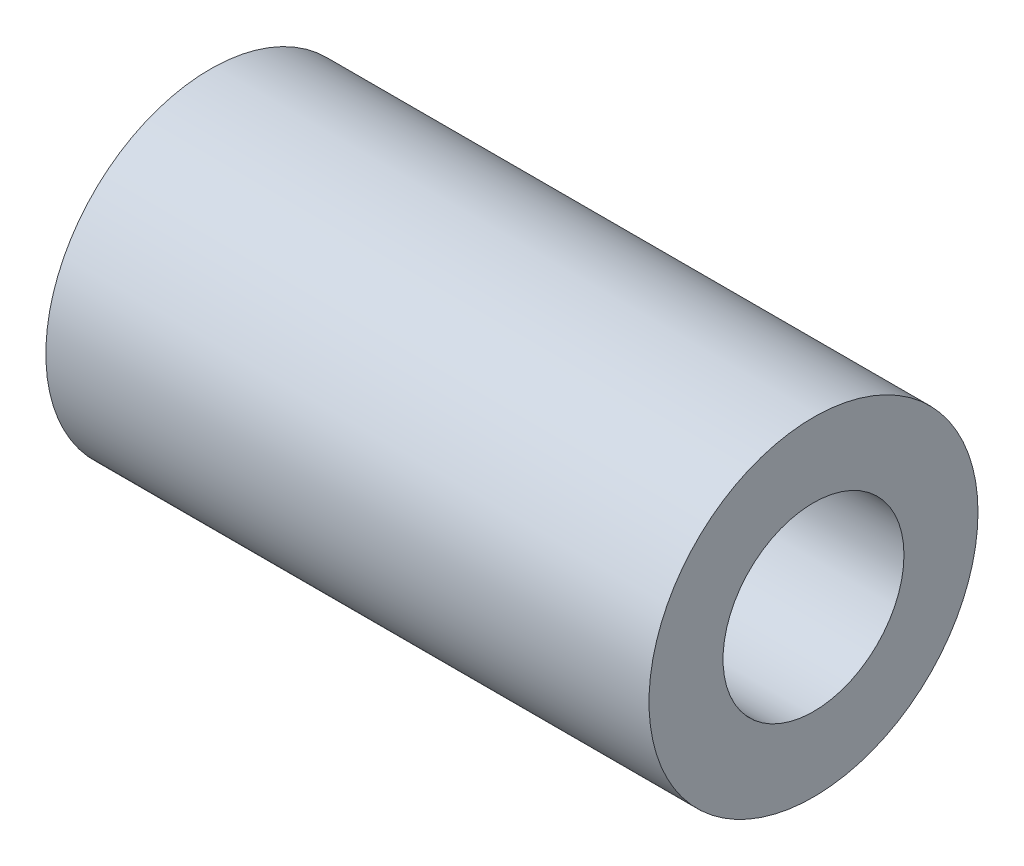
ISO-10303-21;
HEADER;
FILE_DESCRIPTION(('STEP AP214'),'2;1');
FILE_NAME('part.step','',(''),(''),'','','');
FILE_SCHEMA(('AUTOMOTIVE_DESIGN { 1 0 10303 214 1 1 1 1 }'));
ENDSEC;
DATA;
#1=APPLICATION_CONTEXT('core data for automotive mechanical design processes');
#2=APPLICATION_PROTOCOL_DEFINITION('international standard','automotive_design',2000,#1);
#3=PRODUCT_CONTEXT('',#1,'mechanical');
#4=PRODUCT('Part','Part','',(#3));
#5=PRODUCT_RELATED_PRODUCT_CATEGORY('part','',(#4));
#6=PRODUCT_DEFINITION_FORMATION('','',#4);
#7=PRODUCT_DEFINITION_CONTEXT('part definition',#1,'design');
#8=PRODUCT_DEFINITION('design','',#6,#7);
#9=PRODUCT_DEFINITION_SHAPE('','',#8);
#10=(LENGTH_UNIT() NAMED_UNIT(*) SI_UNIT(.MILLI.,.METRE.));
#11=(NAMED_UNIT(*) PLANE_ANGLE_UNIT() SI_UNIT($,.RADIAN.));
#12=(NAMED_UNIT(*) SI_UNIT($,.STERADIAN.) SOLID_ANGLE_UNIT());
#13=UNCERTAINTY_MEASURE_WITH_UNIT(LENGTH_MEASURE(1.E-05),#10,'distance_accuracy_value','');
#14=(GEOMETRIC_REPRESENTATION_CONTEXT(3) GLOBAL_UNCERTAINTY_ASSIGNED_CONTEXT((#13)) GLOBAL_UNIT_ASSIGNED_CONTEXT((#10,
#11,#12)) REPRESENTATION_CONTEXT('',''));
#15=CARTESIAN_POINT('',(0.,0.,0.));
#16=DIRECTION('',(0.,0.,1.));
#17=DIRECTION('',(1.,0.,0.));
#18=AXIS2_PLACEMENT_3D('',#15,#16,#17);
#19=CARTESIAN_POINT('',(0.,0.,0.));
#20=DIRECTION('',(-1.,0.,0.));
#21=DIRECTION('',(0.,0.,1.));
#22=AXIS2_PLACEMENT_3D('',#19,#20,#21);
#23=PLANE('',#22);
#24=CARTESIAN_POINT('',(0.,0.,0.));
#25=DIRECTION('',(1.,0.,0.));
#26=DIRECTION('',(0.,0.,-1.));
#27=AXIS2_PLACEMENT_3D('',#24,#25,#26);
#28=CIRCLE('',#27,3.);
#29=CARTESIAN_POINT('',(0.,0.,-3.));
#30=VERTEX_POINT('',#29);
#31=EDGE_CURVE('E11',#30,#30,#28,.T.);
#32=ORIENTED_EDGE('',*,*,#31,.F.);
#33=EDGE_LOOP('',(#32));
#34=FACE_BOUND('',#33,.T.);
#35=ADVANCED_FACE('F36',(#34),#23,.T.);
#36=CARTESIAN_POINT('',(11.,0.,0.));
#37=DIRECTION('',(1.,0.,0.));
#38=DIRECTION('',(0.,0.,-1.));
#39=AXIS2_PLACEMENT_3D('',#36,#37,#38);
#40=CYLINDRICAL_SURFACE('',#39,3.);
#41=ORIENTED_EDGE('',*,*,#31,.T.);
#42=EDGE_LOOP('',(#41));
#43=FACE_BOUND('',#42,.T.);
#44=CARTESIAN_POINT('',(11.,0.,0.));
#45=DIRECTION('',(1.,0.,0.));
#46=DIRECTION('',(0.,0.,-1.));
#47=AXIS2_PLACEMENT_3D('',#44,#45,#46);
#48=CIRCLE('',#47,3.);
#49=CARTESIAN_POINT('',(11.,0.,-3.));
#50=VERTEX_POINT('',#49);
#51=EDGE_CURVE('E42',#50,#50,#48,.T.);
#52=ORIENTED_EDGE('',*,*,#51,.F.);
#53=EDGE_LOOP('',(#52));
#54=FACE_BOUND('',#53,.T.);
#55=ADVANCED_FACE('F65',(#43,#54),#40,.T.);
#56=CARTESIAN_POINT('',(11.,3.,0.));
#57=DIRECTION('',(1.,0.,0.));
#58=DIRECTION('',(0.,0.,-1.));
#59=AXIS2_PLACEMENT_3D('',#56,#57,#58);
#60=PLANE('',#59);
#61=CARTESIAN_POINT('',(11.,0.,0.));
#62=DIRECTION('',(1.,0.,0.));
#63=DIRECTION('',(0.,0.,-1.));
#64=AXIS2_PLACEMENT_3D('',#61,#62,#63);
#65=CIRCLE('',#64,1.64999999999999);
#66=CARTESIAN_POINT('',(11.,0.,-1.64999999999999));
#67=VERTEX_POINT('',#66);
#68=EDGE_CURVE('E55',#67,#67,#65,.T.);
#69=ORIENTED_EDGE('',*,*,#68,.F.);
#70=EDGE_LOOP('',(#69));
#71=FACE_BOUND('',#70,.T.);
#72=ORIENTED_EDGE('',*,*,#51,.T.);
#73=EDGE_LOOP('',(#72));
#74=FACE_BOUND('',#73,.T.);
#75=ADVANCED_FACE('F49',(#71,#74),#60,.T.);
#76=CARTESIAN_POINT('',(3.,0.,0.));
#77=DIRECTION('',(1.,0.,0.));
#78=DIRECTION('',(0.,0.,-1.));
#79=AXIS2_PLACEMENT_3D('',#76,#77,#78);
#80=CONICAL_SURFACE('',#79,1.65,1.02974425867665);
#81=CARTESIAN_POINT('',(2.00857997860452,0.,0.));
#82=VERTEX_POINT('',#81);
#83=VERTEX_LOOP('',#82);
#84=FACE_BOUND('',#83,.T.);
#85=CARTESIAN_POINT('',(3.,0.,0.));
#86=DIRECTION('',(1.,0.,0.));
#87=DIRECTION('',(0.,0.,-1.));
#88=AXIS2_PLACEMENT_3D('',#85,#86,#87);
#89=CIRCLE('',#88,1.65);
#90=CARTESIAN_POINT('',(3.,0.,-1.65));
#91=VERTEX_POINT('',#90);
#92=EDGE_CURVE('E53',#91,#91,#89,.T.);
#93=ORIENTED_EDGE('',*,*,#92,.T.);
#94=EDGE_LOOP('',(#93));
#95=FACE_BOUND('',#94,.T.);
#96=ADVANCED_FACE('F45',(#84,#95),#80,.F.);
#97=CARTESIAN_POINT('',(11.,0.,0.));
#98=DIRECTION('',(1.,0.,0.));
#99=DIRECTION('',(0.,0.,-1.));
#100=AXIS2_PLACEMENT_3D('',#97,#98,#99);
#101=CYLINDRICAL_SURFACE('',#100,1.64999999999999);
#102=ORIENTED_EDGE('',*,*,#92,.F.);
#103=EDGE_LOOP('',(#102));
#104=FACE_BOUND('',#103,.T.);
#105=ORIENTED_EDGE('',*,*,#68,.T.);
#106=EDGE_LOOP('',(#105));
#107=FACE_BOUND('',#106,.T.);
#108=ADVANCED_FACE('F48',(#104,#107),#101,.F.);
#109=CLOSED_SHELL('',(#35,#55,#75,#96,#108));
#110=MANIFOLD_SOLID_BREP('B2',#109);
#111=ADVANCED_BREP_SHAPE_REPRESENTATION('',(#18,#110),#14);
#112=SHAPE_DEFINITION_REPRESENTATION(#9,#111);
ENDSEC;
END-ISO-10303-21;
